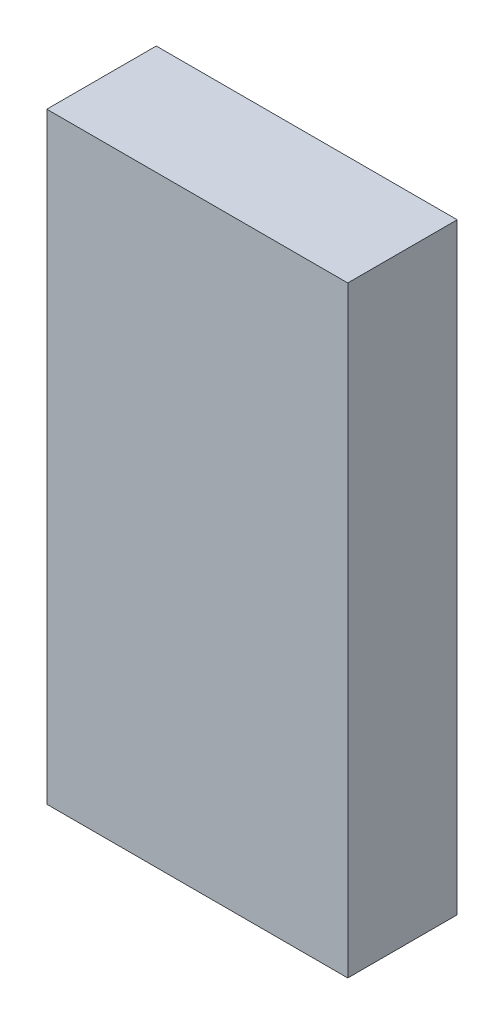
ISO-10303-21;
HEADER;
FILE_DESCRIPTION(('STEP AP214'),'2;1');
FILE_NAME('part.step','',(''),(''),'','','');
FILE_SCHEMA(('AUTOMOTIVE_DESIGN { 1 0 10303 214 1 1 1 1 }'));
ENDSEC;
DATA;
#1=APPLICATION_CONTEXT('core data for automotive mechanical design processes');
#2=APPLICATION_PROTOCOL_DEFINITION('international standard','automotive_design',2000,#1);
#3=PRODUCT_CONTEXT('',#1,'mechanical');
#4=PRODUCT('Part','Part','',(#3));
#5=PRODUCT_RELATED_PRODUCT_CATEGORY('part','',(#4));
#6=PRODUCT_DEFINITION_FORMATION('','',#4);
#7=PRODUCT_DEFINITION_CONTEXT('part definition',#1,'design');
#8=PRODUCT_DEFINITION('design','',#6,#7);
#9=PRODUCT_DEFINITION_SHAPE('','',#8);
#10=(LENGTH_UNIT() NAMED_UNIT(*) SI_UNIT(.MILLI.,.METRE.));
#11=(NAMED_UNIT(*) PLANE_ANGLE_UNIT() SI_UNIT($,.RADIAN.));
#12=(NAMED_UNIT(*) SI_UNIT($,.STERADIAN.) SOLID_ANGLE_UNIT());
#13=UNCERTAINTY_MEASURE_WITH_UNIT(LENGTH_MEASURE(1.E-05),#10,'distance_accuracy_value','');
#14=(GEOMETRIC_REPRESENTATION_CONTEXT(3) GLOBAL_UNCERTAINTY_ASSIGNED_CONTEXT((#13)) GLOBAL_UNIT_ASSIGNED_CONTEXT((#10,
#11,#12)) REPRESENTATION_CONTEXT('',''));
#15=CARTESIAN_POINT('',(0.,0.,0.));
#16=DIRECTION('',(0.,0.,1.));
#17=DIRECTION('',(1.,0.,0.));
#18=AXIS2_PLACEMENT_3D('',#15,#16,#17);
#19=CARTESIAN_POINT('',(55.,-110.,40.));
#20=DIRECTION('',(-1.,0.,0.));
#21=DIRECTION('',(0.,0.,1.));
#22=AXIS2_PLACEMENT_3D('',#19,#20,#21);
#23=PLANE('',#22);
#24=DIRECTION('',(0.,1.,0.));
#25=VECTOR('',#24,1.);
#26=CARTESIAN_POINT('',(55.,-110.,0.));
#27=LINE('',#26,#25);
#28=CARTESIAN_POINT('',(55.,-110.,0.));
#29=VERTEX_POINT('',#28);
#30=CARTESIAN_POINT('',(55.,110.,0.));
#31=VERTEX_POINT('',#30);
#32=EDGE_CURVE('E102',#29,#31,#27,.T.);
#33=ORIENTED_EDGE('',*,*,#32,.T.);
#34=DIRECTION('',(0.,0.,-1.));
#35=VECTOR('',#34,1.);
#36=CARTESIAN_POINT('',(55.,110.,40.));
#37=LINE('',#36,#35);
#38=CARTESIAN_POINT('',(55.,110.,40.));
#39=VERTEX_POINT('',#38);
#40=EDGE_CURVE('E11',#39,#31,#37,.T.);
#41=ORIENTED_EDGE('',*,*,#40,.F.);
#42=DIRECTION('',(0.,1.,0.));
#43=VECTOR('',#42,1.);
#44=CARTESIAN_POINT('',(55.,-110.,40.));
#45=LINE('',#44,#43);
#46=CARTESIAN_POINT('',(55.,-110.,40.));
#47=VERTEX_POINT('',#46);
#48=EDGE_CURVE('E90',#47,#39,#45,.T.);
#49=ORIENTED_EDGE('',*,*,#48,.F.);
#50=DIRECTION('',(0.,0.,-1.));
#51=VECTOR('',#50,1.);
#52=CARTESIAN_POINT('',(55.,-110.,40.));
#53=LINE('',#52,#51);
#54=EDGE_CURVE('E98',#47,#29,#53,.T.);
#55=ORIENTED_EDGE('',*,*,#54,.T.);
#56=EDGE_LOOP('',(#33,#41,#49,#55));
#57=FACE_BOUND('',#56,.T.);
#58=ADVANCED_FACE('F39',(#57),#23,.F.);
#59=CARTESIAN_POINT('',(-55.,110.,40.));
#60=DIRECTION('',(0.,-1.,0.));
#61=DIRECTION('',(0.,0.,-1.));
#62=AXIS2_PLACEMENT_3D('',#59,#60,#61);
#63=PLANE('',#62);
#64=DIRECTION('',(-1.,0.,0.));
#65=VECTOR('',#64,1.);
#66=CARTESIAN_POINT('',(-55.,110.,0.));
#67=LINE('',#66,#65);
#68=CARTESIAN_POINT('',(-55.,110.,0.));
#69=VERTEX_POINT('',#68);
#70=EDGE_CURVE('E94',#31,#69,#67,.T.);
#71=ORIENTED_EDGE('',*,*,#70,.T.);
#72=DIRECTION('',(0.,0.,-1.));
#73=VECTOR('',#72,1.);
#74=CARTESIAN_POINT('',(-55.,110.,40.));
#75=LINE('',#74,#73);
#76=CARTESIAN_POINT('',(-55.,110.,40.));
#77=VERTEX_POINT('',#76);
#78=EDGE_CURVE('E47',#77,#69,#75,.T.);
#79=ORIENTED_EDGE('',*,*,#78,.F.);
#80=DIRECTION('',(-1.,0.,0.));
#81=VECTOR('',#80,1.);
#82=CARTESIAN_POINT('',(-55.,110.,40.));
#83=LINE('',#82,#81);
#84=EDGE_CURVE('E85',#39,#77,#83,.T.);
#85=ORIENTED_EDGE('',*,*,#84,.F.);
#86=ORIENTED_EDGE('',*,*,#40,.T.);
#87=EDGE_LOOP('',(#71,#79,#85,#86));
#88=FACE_BOUND('',#87,.T.);
#89=ADVANCED_FACE('F93',(#88),#63,.F.);
#90=CARTESIAN_POINT('',(-55.,-110.,40.));
#91=DIRECTION('',(1.,0.,0.));
#92=DIRECTION('',(0.,0.,-1.));
#93=AXIS2_PLACEMENT_3D('',#90,#91,#92);
#94=PLANE('',#93);
#95=DIRECTION('',(0.,-1.,0.));
#96=VECTOR('',#95,1.);
#97=CARTESIAN_POINT('',(-55.,-110.,0.));
#98=LINE('',#97,#96);
#99=CARTESIAN_POINT('',(-55.,-110.,0.));
#100=VERTEX_POINT('',#99);
#101=EDGE_CURVE('E72',#69,#100,#98,.T.);
#102=ORIENTED_EDGE('',*,*,#101,.T.);
#103=DIRECTION('',(0.,0.,-1.));
#104=VECTOR('',#103,1.);
#105=CARTESIAN_POINT('',(-55.,-110.,40.));
#106=LINE('',#105,#104);
#107=CARTESIAN_POINT('',(-55.,-110.,40.));
#108=VERTEX_POINT('',#107);
#109=EDGE_CURVE('E95',#108,#100,#106,.T.);
#110=ORIENTED_EDGE('',*,*,#109,.F.);
#111=DIRECTION('',(0.,-1.,0.));
#112=VECTOR('',#111,1.);
#113=CARTESIAN_POINT('',(-55.,-110.,40.));
#114=LINE('',#113,#112);
#115=EDGE_CURVE('E88',#77,#108,#114,.T.);
#116=ORIENTED_EDGE('',*,*,#115,.F.);
#117=ORIENTED_EDGE('',*,*,#78,.T.);
#118=EDGE_LOOP('',(#102,#110,#116,#117));
#119=FACE_BOUND('',#118,.T.);
#120=ADVANCED_FACE('F96',(#119),#94,.F.);
#121=CARTESIAN_POINT('',(-55.,-110.,40.));
#122=DIRECTION('',(0.,1.,0.));
#123=DIRECTION('',(0.,0.,1.));
#124=AXIS2_PLACEMENT_3D('',#121,#122,#123);
#125=PLANE('',#124);
#126=DIRECTION('',(1.,0.,0.));
#127=VECTOR('',#126,1.);
#128=CARTESIAN_POINT('',(-55.,-110.,0.));
#129=LINE('',#128,#127);
#130=EDGE_CURVE('E78',#100,#29,#129,.T.);
#131=ORIENTED_EDGE('',*,*,#130,.T.);
#132=ORIENTED_EDGE('',*,*,#54,.F.);
#133=DIRECTION('',(1.,0.,0.));
#134=VECTOR('',#133,1.);
#135=CARTESIAN_POINT('',(-55.,-110.,40.));
#136=LINE('',#135,#134);
#137=EDGE_CURVE('E55',#108,#47,#136,.T.);
#138=ORIENTED_EDGE('',*,*,#137,.F.);
#139=ORIENTED_EDGE('',*,*,#109,.T.);
#140=EDGE_LOOP('',(#131,#132,#138,#139));
#141=FACE_BOUND('',#140,.T.);
#142=ADVANCED_FACE('F109',(#141),#125,.F.);
#143=CARTESIAN_POINT('',(0.,0.,40.));
#144=DIRECTION('',(0.,0.,-1.));
#145=DIRECTION('',(-1.,0.,0.));
#146=AXIS2_PLACEMENT_3D('',#143,#144,#145);
#147=PLANE('',#146);
#148=ORIENTED_EDGE('',*,*,#48,.T.);
#149=ORIENTED_EDGE('',*,*,#84,.T.);
#150=ORIENTED_EDGE('',*,*,#115,.T.);
#151=ORIENTED_EDGE('',*,*,#137,.T.);
#152=EDGE_LOOP('',(#148,#149,#150,#151));
#153=FACE_BOUND('',#152,.T.);
#154=ADVANCED_FACE('F86',(#153),#147,.F.);
#155=CARTESIAN_POINT('',(0.,0.,0.));
#156=DIRECTION('',(0.,0.,-1.));
#157=DIRECTION('',(-1.,0.,0.));
#158=AXIS2_PLACEMENT_3D('',#155,#156,#157);
#159=PLANE('',#158);
#160=ORIENTED_EDGE('',*,*,#32,.F.);
#161=ORIENTED_EDGE('',*,*,#130,.F.);
#162=ORIENTED_EDGE('',*,*,#101,.F.);
#163=ORIENTED_EDGE('',*,*,#70,.F.);
#164=EDGE_LOOP('',(#160,#161,#162,#163));
#165=FACE_BOUND('',#164,.T.);
#166=ADVANCED_FACE('F112',(#165),#159,.T.);
#167=CLOSED_SHELL('',(#58,#89,#120,#142,#154,#166));
#168=MANIFOLD_SOLID_BREP('B2',#167);
#169=ADVANCED_BREP_SHAPE_REPRESENTATION('',(#18,#168),#14);
#170=SHAPE_DEFINITION_REPRESENTATION(#9,#169);
ENDSEC;
END-ISO-10303-21;
